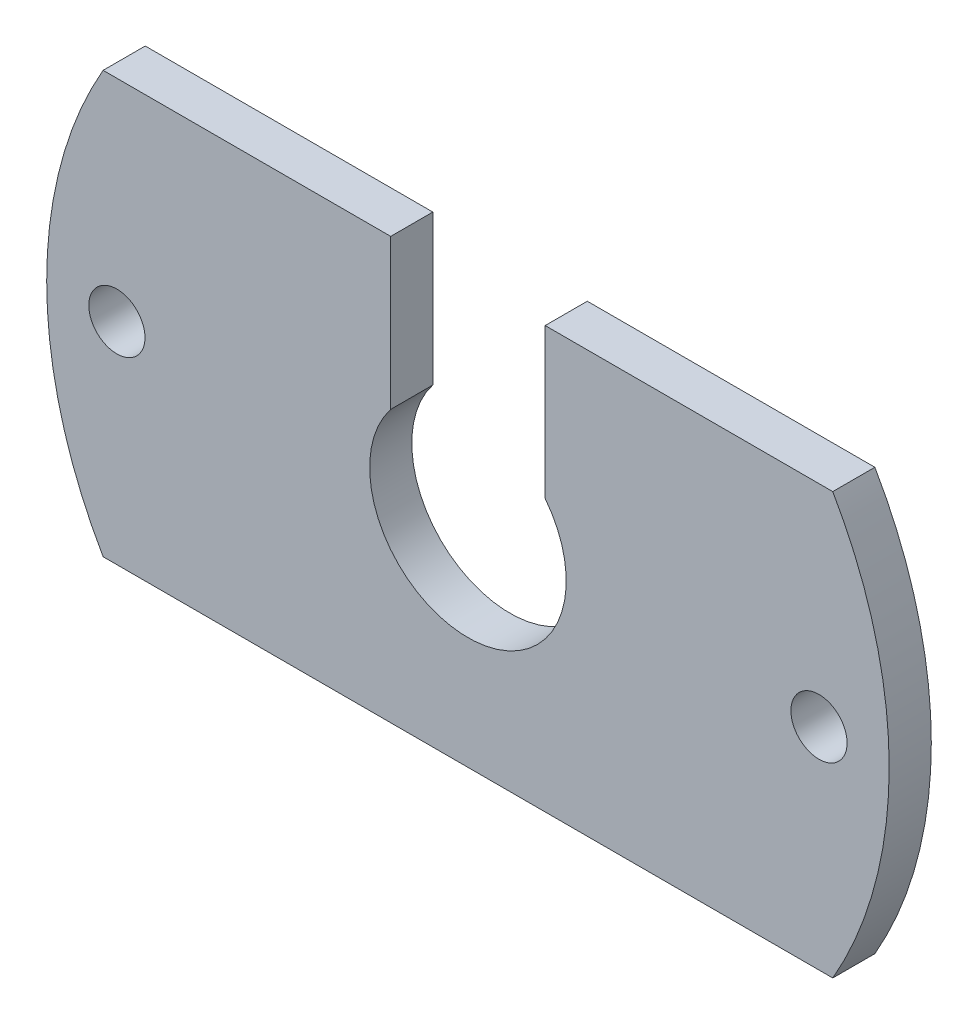
ISO-10303-21;
HEADER;
FILE_DESCRIPTION(('STEP AP214'),'2;1');
FILE_NAME('part.step','',(''),(''),'','','');
FILE_SCHEMA(('AUTOMOTIVE_DESIGN { 1 0 10303 214 1 1 1 1 }'));
ENDSEC;
DATA;
#1=APPLICATION_CONTEXT('core data for automotive mechanical design processes');
#2=APPLICATION_PROTOCOL_DEFINITION('international standard','automotive_design',2000,#1);
#3=PRODUCT_CONTEXT('',#1,'mechanical');
#4=PRODUCT('Part','Part','',(#3));
#5=PRODUCT_RELATED_PRODUCT_CATEGORY('part','',(#4));
#6=PRODUCT_DEFINITION_FORMATION('','',#4);
#7=PRODUCT_DEFINITION_CONTEXT('part definition',#1,'design');
#8=PRODUCT_DEFINITION('design','',#6,#7);
#9=PRODUCT_DEFINITION_SHAPE('','',#8);
#10=(LENGTH_UNIT() NAMED_UNIT(*) SI_UNIT(.MILLI.,.METRE.));
#11=(NAMED_UNIT(*) PLANE_ANGLE_UNIT() SI_UNIT($,.RADIAN.));
#12=(NAMED_UNIT(*) SI_UNIT($,.STERADIAN.) SOLID_ANGLE_UNIT());
#13=UNCERTAINTY_MEASURE_WITH_UNIT(LENGTH_MEASURE(1.E-05),#10,'distance_accuracy_value','');
#14=(GEOMETRIC_REPRESENTATION_CONTEXT(3) GLOBAL_UNCERTAINTY_ASSIGNED_CONTEXT((#13)) GLOBAL_UNIT_ASSIGNED_CONTEXT((#10,
#11,#12)) REPRESENTATION_CONTEXT('',''));
#15=CARTESIAN_POINT('',(0.,0.,0.));
#16=DIRECTION('',(0.,0.,1.));
#17=DIRECTION('',(1.,0.,0.));
#18=AXIS2_PLACEMENT_3D('',#15,#16,#17);
#19=CARTESIAN_POINT('',(0.,0.,3.));
#20=DIRECTION('',(0.,0.,1.));
#21=DIRECTION('',(1.,0.,0.));
#22=AXIS2_PLACEMENT_3D('',#19,#20,#21);
#23=PLANE('',#22);
#24=CARTESIAN_POINT('',(-25.,0.,3.));
#25=DIRECTION('',(0.,0.,1.));
#26=DIRECTION('',(1.,0.,0.));
#27=AXIS2_PLACEMENT_3D('',#24,#25,#26);
#28=CIRCLE('',#27,2.);
#29=CARTESIAN_POINT('',(-23.,0.,3.));
#30=VERTEX_POINT('',#29);
#31=EDGE_CURVE('E133',#30,#30,#28,.T.);
#32=ORIENTED_EDGE('',*,*,#31,.F.);
#33=EDGE_LOOP('',(#32));
#34=FACE_BOUND('',#33,.T.);
#35=CARTESIAN_POINT('',(0.,0.,3.));
#36=DIRECTION('',(0.,0.,1.));
#37=DIRECTION('',(1.,0.,0.));
#38=AXIS2_PLACEMENT_3D('',#35,#36,#37);
#39=CIRCLE('',#38,30.);
#40=CARTESIAN_POINT('',(-25.9807621135332,15.,3.));
#41=VERTEX_POINT('',#40);
#42=CARTESIAN_POINT('',(-25.9807621135332,-15.,3.));
#43=VERTEX_POINT('',#42);
#44=EDGE_CURVE('E144',#41,#43,#39,.T.);
#45=ORIENTED_EDGE('',*,*,#44,.T.);
#46=DIRECTION('',(1.,0.,0.));
#47=VECTOR('',#46,1.);
#48=CARTESIAN_POINT('',(25.9807621135332,-15.,3.));
#49=LINE('',#48,#47);
#50=CARTESIAN_POINT('',(25.9807621135331,-15.,3.));
#51=VERTEX_POINT('',#50);
#52=EDGE_CURVE('E92',#43,#51,#49,.T.);
#53=ORIENTED_EDGE('',*,*,#52,.T.);
#54=CARTESIAN_POINT('',(0.,0.,3.));
#55=DIRECTION('',(0.,0.,1.));
#56=DIRECTION('',(1.,0.,0.));
#57=AXIS2_PLACEMENT_3D('',#54,#55,#56);
#58=CIRCLE('',#57,30.);
#59=CARTESIAN_POINT('',(25.9807621135332,15.,3.));
#60=VERTEX_POINT('',#59);
#61=EDGE_CURVE('E159',#51,#60,#58,.T.);
#62=ORIENTED_EDGE('',*,*,#61,.T.);
#63=DIRECTION('',(-1.,0.,0.));
#64=VECTOR('',#63,1.);
#65=CARTESIAN_POINT('',(25.9807621135332,15.,3.));
#66=LINE('',#65,#64);
#67=CARTESIAN_POINT('',(5.50000000000001,15.,3.));
#68=VERTEX_POINT('',#67);
#69=EDGE_CURVE('E172',#60,#68,#66,.T.);
#70=ORIENTED_EDGE('',*,*,#69,.T.);
#71=DIRECTION('',(0.,-1.,0.));
#72=VECTOR('',#71,1.);
#73=CARTESIAN_POINT('',(5.50000000000001,15.,3.));
#74=LINE('',#73,#72);
#75=CARTESIAN_POINT('',(5.50000000000001,4.33012701892219,3.));
#76=VERTEX_POINT('',#75);
#77=EDGE_CURVE('E111',#68,#76,#74,.T.);
#78=ORIENTED_EDGE('',*,*,#77,.T.);
#79=CARTESIAN_POINT('',(0.,0.,3.));
#80=DIRECTION('',(0.,0.,-1.));
#81=DIRECTION('',(1.,0.,0.));
#82=AXIS2_PLACEMENT_3D('',#79,#80,#81);
#83=CIRCLE('',#82,7.);
#84=CARTESIAN_POINT('',(-5.49999999999999,4.3301270189222,3.));
#85=VERTEX_POINT('',#84);
#86=EDGE_CURVE('E105',#76,#85,#83,.T.);
#87=ORIENTED_EDGE('',*,*,#86,.T.);
#88=DIRECTION('',(0.,1.,0.));
#89=VECTOR('',#88,1.);
#90=CARTESIAN_POINT('',(-5.49999999999999,15.,3.));
#91=LINE('',#90,#89);
#92=CARTESIAN_POINT('',(-5.49999999999999,15.,3.));
#93=VERTEX_POINT('',#92);
#94=EDGE_CURVE('E109',#85,#93,#91,.T.);
#95=ORIENTED_EDGE('',*,*,#94,.T.);
#96=DIRECTION('',(-1.,0.,0.));
#97=VECTOR('',#96,1.);
#98=CARTESIAN_POINT('',(-5.49999999999999,15.,3.));
#99=LINE('',#98,#97);
#100=EDGE_CURVE('E49',#93,#41,#99,.T.);
#101=ORIENTED_EDGE('',*,*,#100,.T.);
#102=EDGE_LOOP('',(#45,#53,#62,#70,#78,#87,#95,#101));
#103=FACE_BOUND('',#102,.T.);
#104=CARTESIAN_POINT('',(25.,0.,3.));
#105=DIRECTION('',(0.,0.,1.));
#106=DIRECTION('',(1.,0.,0.));
#107=AXIS2_PLACEMENT_3D('',#104,#105,#106);
#108=CIRCLE('',#107,2.);
#109=CARTESIAN_POINT('',(27.,0.,3.));
#110=VERTEX_POINT('',#109);
#111=EDGE_CURVE('E181',#110,#110,#108,.T.);
#112=ORIENTED_EDGE('',*,*,#111,.F.);
#113=EDGE_LOOP('',(#112));
#114=FACE_BOUND('',#113,.T.);
#115=ADVANCED_FACE('F32',(#34,#103,#114),#23,.T.);
#116=CARTESIAN_POINT('',(0.,0.,0.));
#117=DIRECTION('',(0.,0.,1.));
#118=DIRECTION('',(1.,0.,0.));
#119=AXIS2_PLACEMENT_3D('',#116,#117,#118);
#120=PLANE('',#119);
#121=CARTESIAN_POINT('',(-25.,0.,0.));
#122=DIRECTION('',(0.,0.,1.));
#123=DIRECTION('',(1.,0.,0.));
#124=AXIS2_PLACEMENT_3D('',#121,#122,#123);
#125=CIRCLE('',#124,2.);
#126=CARTESIAN_POINT('',(-23.,0.,0.));
#127=VERTEX_POINT('',#126);
#128=EDGE_CURVE('E178',#127,#127,#125,.T.);
#129=ORIENTED_EDGE('',*,*,#128,.T.);
#130=EDGE_LOOP('',(#129));
#131=FACE_BOUND('',#130,.T.);
#132=CARTESIAN_POINT('',(0.,0.,0.));
#133=DIRECTION('',(0.,0.,1.));
#134=DIRECTION('',(1.,0.,0.));
#135=AXIS2_PLACEMENT_3D('',#132,#133,#134);
#136=CIRCLE('',#135,30.);
#137=CARTESIAN_POINT('',(-25.9807621135332,15.,0.));
#138=VERTEX_POINT('',#137);
#139=CARTESIAN_POINT('',(-25.9807621135332,-15.,0.));
#140=VERTEX_POINT('',#139);
#141=EDGE_CURVE('E129',#138,#140,#136,.T.);
#142=ORIENTED_EDGE('',*,*,#141,.F.);
#143=DIRECTION('',(-1.,0.,0.));
#144=VECTOR('',#143,1.);
#145=CARTESIAN_POINT('',(-5.49999999999999,15.,0.));
#146=LINE('',#145,#144);
#147=CARTESIAN_POINT('',(-5.49999999999999,15.,0.));
#148=VERTEX_POINT('',#147);
#149=EDGE_CURVE('E84',#148,#138,#146,.T.);
#150=ORIENTED_EDGE('',*,*,#149,.F.);
#151=DIRECTION('',(0.,1.,0.));
#152=VECTOR('',#151,1.);
#153=CARTESIAN_POINT('',(-5.49999999999999,15.,0.));
#154=LINE('',#153,#152);
#155=CARTESIAN_POINT('',(-5.49999999999999,4.3301270189222,0.));
#156=VERTEX_POINT('',#155);
#157=EDGE_CURVE('E78',#156,#148,#154,.T.);
#158=ORIENTED_EDGE('',*,*,#157,.F.);
#159=CARTESIAN_POINT('',(0.,0.,0.));
#160=DIRECTION('',(0.,0.,-1.));
#161=DIRECTION('',(1.,0.,0.));
#162=AXIS2_PLACEMENT_3D('',#159,#160,#161);
#163=CIRCLE('',#162,7.);
#164=CARTESIAN_POINT('',(5.50000000000001,4.33012701892219,0.));
#165=VERTEX_POINT('',#164);
#166=EDGE_CURVE('E119',#165,#156,#163,.T.);
#167=ORIENTED_EDGE('',*,*,#166,.F.);
#168=DIRECTION('',(0.,-1.,0.));
#169=VECTOR('',#168,1.);
#170=CARTESIAN_POINT('',(5.50000000000001,15.,0.));
#171=LINE('',#170,#169);
#172=CARTESIAN_POINT('',(5.50000000000001,15.,0.));
#173=VERTEX_POINT('',#172);
#174=EDGE_CURVE('E139',#173,#165,#171,.T.);
#175=ORIENTED_EDGE('',*,*,#174,.F.);
#176=DIRECTION('',(-1.,0.,0.));
#177=VECTOR('',#176,1.);
#178=CARTESIAN_POINT('',(25.9807621135332,15.,0.));
#179=LINE('',#178,#177);
#180=CARTESIAN_POINT('',(25.9807621135332,15.,0.));
#181=VERTEX_POINT('',#180);
#182=EDGE_CURVE('E137',#181,#173,#179,.T.);
#183=ORIENTED_EDGE('',*,*,#182,.F.);
#184=CARTESIAN_POINT('',(0.,0.,0.));
#185=DIRECTION('',(0.,0.,1.));
#186=DIRECTION('',(1.,0.,0.));
#187=AXIS2_PLACEMENT_3D('',#184,#185,#186);
#188=CIRCLE('',#187,30.);
#189=CARTESIAN_POINT('',(25.9807621135331,-15.,0.));
#190=VERTEX_POINT('',#189);
#191=EDGE_CURVE('E135',#190,#181,#188,.T.);
#192=ORIENTED_EDGE('',*,*,#191,.F.);
#193=DIRECTION('',(1.,0.,0.));
#194=VECTOR('',#193,1.);
#195=CARTESIAN_POINT('',(25.9807621135332,-15.,0.));
#196=LINE('',#195,#194);
#197=EDGE_CURVE('E132',#140,#190,#196,.T.);
#198=ORIENTED_EDGE('',*,*,#197,.F.);
#199=EDGE_LOOP('',(#142,#150,#158,#167,#175,#183,#192,#198));
#200=FACE_BOUND('',#199,.T.);
#201=CARTESIAN_POINT('',(25.,0.,0.));
#202=DIRECTION('',(0.,0.,1.));
#203=DIRECTION('',(1.,0.,0.));
#204=AXIS2_PLACEMENT_3D('',#201,#202,#203);
#205=CIRCLE('',#204,2.);
#206=CARTESIAN_POINT('',(27.,0.,0.));
#207=VERTEX_POINT('',#206);
#208=EDGE_CURVE('E184',#207,#207,#205,.T.);
#209=ORIENTED_EDGE('',*,*,#208,.T.);
#210=EDGE_LOOP('',(#209));
#211=FACE_BOUND('',#210,.T.);
#212=ADVANCED_FACE('F163',(#131,#200,#211),#120,.F.);
#213=CARTESIAN_POINT('',(0.,0.,3.));
#214=DIRECTION('',(0.,0.,-1.));
#215=DIRECTION('',(-1.,0.,0.));
#216=AXIS2_PLACEMENT_3D('',#213,#214,#215);
#217=CYLINDRICAL_SURFACE('',#216,30.);
#218=ORIENTED_EDGE('',*,*,#141,.T.);
#219=DIRECTION('',(0.,0.,-1.));
#220=VECTOR('',#219,1.);
#221=CARTESIAN_POINT('',(-25.9807621135332,-15.,3.));
#222=LINE('',#221,#220);
#223=EDGE_CURVE('E11',#43,#140,#222,.T.);
#224=ORIENTED_EDGE('',*,*,#223,.F.);
#225=ORIENTED_EDGE('',*,*,#44,.F.);
#226=DIRECTION('',(0.,0.,-1.));
#227=VECTOR('',#226,1.);
#228=CARTESIAN_POINT('',(-25.9807621135332,15.,3.));
#229=LINE('',#228,#227);
#230=EDGE_CURVE('E125',#41,#138,#229,.T.);
#231=ORIENTED_EDGE('',*,*,#230,.T.);
#232=EDGE_LOOP('',(#218,#224,#225,#231));
#233=FACE_BOUND('',#232,.T.);
#234=ADVANCED_FACE('F34',(#233),#217,.T.);
#235=CARTESIAN_POINT('',(25.9807621135332,-15.,3.));
#236=DIRECTION('',(0.,1.,0.));
#237=DIRECTION('',(0.,0.,1.));
#238=AXIS2_PLACEMENT_3D('',#235,#236,#237);
#239=PLANE('',#238);
#240=ORIENTED_EDGE('',*,*,#197,.T.);
#241=DIRECTION('',(0.,0.,-1.));
#242=VECTOR('',#241,1.);
#243=CARTESIAN_POINT('',(25.9807621135331,-15.,3.));
#244=LINE('',#243,#242);
#245=EDGE_CURVE('E41',#51,#190,#244,.T.);
#246=ORIENTED_EDGE('',*,*,#245,.F.);
#247=ORIENTED_EDGE('',*,*,#52,.F.);
#248=ORIENTED_EDGE('',*,*,#223,.T.);
#249=EDGE_LOOP('',(#240,#246,#247,#248));
#250=FACE_BOUND('',#249,.T.);
#251=ADVANCED_FACE('F217',(#250),#239,.F.);
#252=CARTESIAN_POINT('',(0.,0.,3.));
#253=DIRECTION('',(0.,0.,-1.));
#254=DIRECTION('',(-1.,0.,0.));
#255=AXIS2_PLACEMENT_3D('',#252,#253,#254);
#256=CYLINDRICAL_SURFACE('',#255,30.);
#257=ORIENTED_EDGE('',*,*,#191,.T.);
#258=DIRECTION('',(0.,0.,-1.));
#259=VECTOR('',#258,1.);
#260=CARTESIAN_POINT('',(25.9807621135332,15.,3.));
#261=LINE('',#260,#259);
#262=EDGE_CURVE('E151',#60,#181,#261,.T.);
#263=ORIENTED_EDGE('',*,*,#262,.F.);
#264=ORIENTED_EDGE('',*,*,#61,.F.);
#265=ORIENTED_EDGE('',*,*,#245,.T.);
#266=EDGE_LOOP('',(#257,#263,#264,#265));
#267=FACE_BOUND('',#266,.T.);
#268=ADVANCED_FACE('F157',(#267),#256,.T.);
#269=CARTESIAN_POINT('',(25.9807621135332,15.,3.));
#270=DIRECTION('',(0.,-1.,0.));
#271=DIRECTION('',(0.,0.,-1.));
#272=AXIS2_PLACEMENT_3D('',#269,#270,#271);
#273=PLANE('',#272);
#274=ORIENTED_EDGE('',*,*,#182,.T.);
#275=DIRECTION('',(0.,0.,-1.));
#276=VECTOR('',#275,1.);
#277=CARTESIAN_POINT('',(5.50000000000001,15.,3.));
#278=LINE('',#277,#276);
#279=EDGE_CURVE('E148',#68,#173,#278,.T.);
#280=ORIENTED_EDGE('',*,*,#279,.F.);
#281=ORIENTED_EDGE('',*,*,#69,.F.);
#282=ORIENTED_EDGE('',*,*,#262,.T.);
#283=EDGE_LOOP('',(#274,#280,#281,#282));
#284=FACE_BOUND('',#283,.T.);
#285=ADVANCED_FACE('F168',(#284),#273,.F.);
#286=CARTESIAN_POINT('',(5.50000000000001,15.,3.));
#287=DIRECTION('',(1.,0.,0.));
#288=DIRECTION('',(0.,1.,0.));
#289=AXIS2_PLACEMENT_3D('',#286,#287,#288);
#290=PLANE('',#289);
#291=ORIENTED_EDGE('',*,*,#174,.T.);
#292=DIRECTION('',(0.,0.,-1.));
#293=VECTOR('',#292,1.);
#294=CARTESIAN_POINT('',(5.50000000000001,4.33012701892219,3.));
#295=LINE('',#294,#293);
#296=EDGE_CURVE('E120',#76,#165,#295,.T.);
#297=ORIENTED_EDGE('',*,*,#296,.F.);
#298=ORIENTED_EDGE('',*,*,#77,.F.);
#299=ORIENTED_EDGE('',*,*,#279,.T.);
#300=EDGE_LOOP('',(#291,#297,#298,#299));
#301=FACE_BOUND('',#300,.T.);
#302=ADVANCED_FACE('F171',(#301),#290,.F.);
#303=CARTESIAN_POINT('',(0.,0.,3.));
#304=DIRECTION('',(0.,0.,-1.));
#305=DIRECTION('',(-1.,0.,0.));
#306=AXIS2_PLACEMENT_3D('',#303,#304,#305);
#307=CYLINDRICAL_SURFACE('',#306,7.);
#308=ORIENTED_EDGE('',*,*,#166,.T.);
#309=DIRECTION('',(0.,0.,-1.));
#310=VECTOR('',#309,1.);
#311=CARTESIAN_POINT('',(-5.49999999999999,4.3301270189222,3.));
#312=LINE('',#311,#310);
#313=EDGE_CURVE('E116',#85,#156,#312,.T.);
#314=ORIENTED_EDGE('',*,*,#313,.F.);
#315=ORIENTED_EDGE('',*,*,#86,.F.);
#316=ORIENTED_EDGE('',*,*,#296,.T.);
#317=EDGE_LOOP('',(#308,#314,#315,#316));
#318=FACE_BOUND('',#317,.T.);
#319=ADVANCED_FACE('F117',(#318),#307,.F.);
#320=CARTESIAN_POINT('',(-5.49999999999999,15.,3.));
#321=DIRECTION('',(-1.,0.,0.));
#322=DIRECTION('',(0.,-1.,0.));
#323=AXIS2_PLACEMENT_3D('',#320,#321,#322);
#324=PLANE('',#323);
#325=ORIENTED_EDGE('',*,*,#157,.T.);
#326=DIRECTION('',(0.,0.,-1.));
#327=VECTOR('',#326,1.);
#328=CARTESIAN_POINT('',(-5.49999999999999,15.,3.));
#329=LINE('',#328,#327);
#330=EDGE_CURVE('E121',#93,#148,#329,.T.);
#331=ORIENTED_EDGE('',*,*,#330,.F.);
#332=ORIENTED_EDGE('',*,*,#94,.F.);
#333=ORIENTED_EDGE('',*,*,#313,.T.);
#334=EDGE_LOOP('',(#325,#331,#332,#333));
#335=FACE_BOUND('',#334,.T.);
#336=ADVANCED_FACE('F123',(#335),#324,.F.);
#337=CARTESIAN_POINT('',(-5.49999999999999,15.,3.));
#338=DIRECTION('',(0.,-1.,0.));
#339=DIRECTION('',(0.,0.,-1.));
#340=AXIS2_PLACEMENT_3D('',#337,#338,#339);
#341=PLANE('',#340);
#342=ORIENTED_EDGE('',*,*,#149,.T.);
#343=ORIENTED_EDGE('',*,*,#230,.F.);
#344=ORIENTED_EDGE('',*,*,#100,.F.);
#345=ORIENTED_EDGE('',*,*,#330,.T.);
#346=EDGE_LOOP('',(#342,#343,#344,#345));
#347=FACE_BOUND('',#346,.T.);
#348=ADVANCED_FACE('F205',(#347),#341,.F.);
#349=CARTESIAN_POINT('',(-25.,0.,3.));
#350=DIRECTION('',(0.,0.,-1.));
#351=DIRECTION('',(-1.,0.,0.));
#352=AXIS2_PLACEMENT_3D('',#349,#350,#351);
#353=CYLINDRICAL_SURFACE('',#352,2.);
#354=ORIENTED_EDGE('',*,*,#31,.T.);
#355=EDGE_LOOP('',(#354));
#356=FACE_BOUND('',#355,.T.);
#357=ORIENTED_EDGE('',*,*,#128,.F.);
#358=EDGE_LOOP('',(#357));
#359=FACE_BOUND('',#358,.T.);
#360=ADVANCED_FACE('F202',(#356,#359),#353,.F.);
#361=CARTESIAN_POINT('',(25.,0.,3.));
#362=DIRECTION('',(0.,0.,-1.));
#363=DIRECTION('',(-1.,0.,0.));
#364=AXIS2_PLACEMENT_3D('',#361,#362,#363);
#365=CYLINDRICAL_SURFACE('',#364,2.);
#366=ORIENTED_EDGE('',*,*,#111,.T.);
#367=EDGE_LOOP('',(#366));
#368=FACE_BOUND('',#367,.T.);
#369=ORIENTED_EDGE('',*,*,#208,.F.);
#370=EDGE_LOOP('',(#369));
#371=FACE_BOUND('',#370,.T.);
#372=ADVANCED_FACE('F190',(#368,#371),#365,.F.);
#373=CLOSED_SHELL('',(#115,#212,#234,#251,#268,#285,#302,#319,#336,#348,#360,#372));
#374=MANIFOLD_SOLID_BREP('B2',#373);
#375=ADVANCED_BREP_SHAPE_REPRESENTATION('',(#18,#374),#14);
#376=SHAPE_DEFINITION_REPRESENTATION(#9,#375);
ENDSEC;
END-ISO-10303-21;
